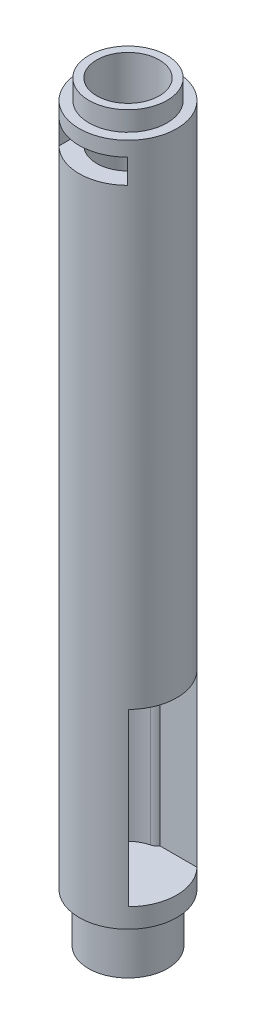
ISO-10303-21;
HEADER;
FILE_DESCRIPTION(('STEP AP214'),'2;1');
FILE_NAME('part.step','',(''),(''),'','','');
FILE_SCHEMA(('AUTOMOTIVE_DESIGN { 1 0 10303 214 1 1 1 1 }'));
ENDSEC;
DATA;
#1=APPLICATION_CONTEXT('core data for automotive mechanical design processes');
#2=APPLICATION_PROTOCOL_DEFINITION('international standard','automotive_design',2000,#1);
#3=PRODUCT_CONTEXT('',#1,'mechanical');
#4=PRODUCT('Part','Part','',(#3));
#5=PRODUCT_RELATED_PRODUCT_CATEGORY('part','',(#4));
#6=PRODUCT_DEFINITION_FORMATION('','',#4);
#7=PRODUCT_DEFINITION_CONTEXT('part definition',#1,'design');
#8=PRODUCT_DEFINITION('design','',#6,#7);
#9=PRODUCT_DEFINITION_SHAPE('','',#8);
#10=(LENGTH_UNIT() NAMED_UNIT(*) SI_UNIT(.MILLI.,.METRE.));
#11=(NAMED_UNIT(*) PLANE_ANGLE_UNIT() SI_UNIT($,.RADIAN.));
#12=(NAMED_UNIT(*) SI_UNIT($,.STERADIAN.) SOLID_ANGLE_UNIT());
#13=UNCERTAINTY_MEASURE_WITH_UNIT(LENGTH_MEASURE(1.E-05),#10,'distance_accuracy_value','');
#14=(GEOMETRIC_REPRESENTATION_CONTEXT(3) GLOBAL_UNCERTAINTY_ASSIGNED_CONTEXT((#13)) GLOBAL_UNIT_ASSIGNED_CONTEXT((#10,
#11,#12)) REPRESENTATION_CONTEXT('',''));
#15=CARTESIAN_POINT('',(0.,0.,0.));
#16=DIRECTION('',(0.,0.,1.));
#17=DIRECTION('',(1.,0.,0.));
#18=AXIS2_PLACEMENT_3D('',#15,#16,#17);
#19=CARTESIAN_POINT('',(0.,-12.7,0.));
#20=DIRECTION('',(0.,1.,0.));
#21=DIRECTION('',(0.,0.,1.));
#22=AXIS2_PLACEMENT_3D('',#19,#20,#21);
#23=CYLINDRICAL_SURFACE('',#22,10.287);
#24=CARTESIAN_POINT('',(0.,-12.7,0.));
#25=DIRECTION('',(0.,-1.,0.));
#26=DIRECTION('',(0.,0.,-1.));
#27=AXIS2_PLACEMENT_3D('',#24,#25,#26);
#28=CIRCLE('',#27,10.287);
#29=CARTESIAN_POINT('',(0.,-12.7,-10.287));
#30=VERTEX_POINT('',#29);
#31=EDGE_CURVE('E229',#30,#30,#28,.T.);
#32=ORIENTED_EDGE('',*,*,#31,.F.);
#33=EDGE_LOOP('',(#32));
#34=FACE_BOUND('',#33,.T.);
#35=CARTESIAN_POINT('',(0.,0.,0.));
#36=DIRECTION('',(0.,1.,0.));
#37=DIRECTION('',(0.,0.,1.));
#38=AXIS2_PLACEMENT_3D('',#35,#36,#37);
#39=CIRCLE('',#38,10.287);
#40=CARTESIAN_POINT('',(0.,0.,10.287));
#41=VERTEX_POINT('',#40);
#42=EDGE_CURVE('E235',#41,#41,#39,.F.);
#43=ORIENTED_EDGE('',*,*,#42,.T.);
#44=EDGE_LOOP('',(#43));
#45=FACE_BOUND('',#44,.T.);
#46=ADVANCED_FACE('F41',(#34,#45),#23,.T.);
#47=CARTESIAN_POINT('',(0.,-12.7,0.));
#48=DIRECTION('',(0.,-1.,0.));
#49=DIRECTION('',(0.,0.,-1.));
#50=AXIS2_PLACEMENT_3D('',#47,#48,#49);
#51=PLANE('',#50);
#52=ORIENTED_EDGE('',*,*,#31,.T.);
#53=EDGE_LOOP('',(#52));
#54=FACE_BOUND('',#53,.T.);
#55=ADVANCED_FACE('F305',(#54),#51,.T.);
#56=CARTESIAN_POINT('',(0.,0.,0.));
#57=DIRECTION('',(0.,1.,0.));
#58=DIRECTION('',(0.,0.,1.));
#59=AXIS2_PLACEMENT_3D('',#56,#57,#58);
#60=PLANE('',#59);
#61=CARTESIAN_POINT('',(0.,0.,0.));
#62=DIRECTION('',(0.,1.,0.));
#63=DIRECTION('',(0.,0.,1.));
#64=AXIS2_PLACEMENT_3D('',#61,#62,#63);
#65=CIRCLE('',#64,12.7);
#66=CARTESIAN_POINT('',(0.,0.,12.7));
#67=VERTEX_POINT('',#66);
#68=EDGE_CURVE('E232',#67,#67,#65,.T.);
#69=ORIENTED_EDGE('',*,*,#68,.F.);
#70=EDGE_LOOP('',(#69));
#71=FACE_BOUND('',#70,.T.);
#72=ORIENTED_EDGE('',*,*,#42,.F.);
#73=EDGE_LOOP('',(#72));
#74=FACE_BOUND('',#73,.T.);
#75=ADVANCED_FACE('F300',(#71,#74),#60,.F.);
#76=CARTESIAN_POINT('',(0.,177.8,0.));
#77=DIRECTION('',(0.,-1.,0.));
#78=DIRECTION('',(0.,0.,-1.));
#79=AXIS2_PLACEMENT_3D('',#76,#77,#78);
#80=CYLINDRICAL_SURFACE('',#79,12.7);
#81=CARTESIAN_POINT('',(0.,173.99,0.));
#82=DIRECTION('',(0.,1.,0.));
#83=DIRECTION('',(0.,0.,1.));
#84=AXIS2_PLACEMENT_3D('',#81,#82,#83);
#85=CIRCLE('',#84,12.7);
#86=CARTESIAN_POINT('',(-8.89000000000003,173.99,9.06961410424939));
#87=VERTEX_POINT('',#86);
#88=CARTESIAN_POINT('',(8.88999999999997,173.99,9.06961410424945));
#89=VERTEX_POINT('',#88);
#90=EDGE_CURVE('E157',#87,#89,#85,.T.);
#91=ORIENTED_EDGE('',*,*,#90,.T.);
#92=DIRECTION('',(0.,-1.,0.));
#93=VECTOR('',#92,1.);
#94=CARTESIAN_POINT('',(8.88999999999997,177.8,9.06961410424945));
#95=LINE('',#94,#93);
#96=CARTESIAN_POINT('',(8.88999999999997,167.64,9.06961410424945));
#97=VERTEX_POINT('',#96);
#98=EDGE_CURVE('E145',#89,#97,#95,.T.);
#99=ORIENTED_EDGE('',*,*,#98,.T.);
#100=CARTESIAN_POINT('',(0.,167.64,0.));
#101=DIRECTION('',(0.,-1.,0.));
#102=DIRECTION('',(0.,0.,-1.));
#103=AXIS2_PLACEMENT_3D('',#100,#101,#102);
#104=CIRCLE('',#103,12.7);
#105=CARTESIAN_POINT('',(-8.89000000000003,167.64,9.06961410424939));
#106=VERTEX_POINT('',#105);
#107=EDGE_CURVE('E164',#97,#106,#104,.T.);
#108=ORIENTED_EDGE('',*,*,#107,.T.);
#109=DIRECTION('',(0.,-1.,0.));
#110=VECTOR('',#109,1.);
#111=CARTESIAN_POINT('',(-8.89000000000003,177.8,9.06961410424939));
#112=LINE('',#111,#110);
#113=EDGE_CURVE('E240',#106,#87,#112,.F.);
#114=ORIENTED_EDGE('',*,*,#113,.T.);
#115=EDGE_LOOP('',(#91,#99,#108,#114));
#116=FACE_BOUND('',#115,.T.);
#117=ORIENTED_EDGE('',*,*,#68,.T.);
#118=EDGE_LOOP('',(#117));
#119=FACE_BOUND('',#118,.T.);
#120=CARTESIAN_POINT('',(0.,49.53,0.));
#121=DIRECTION('',(0.,1.,0.));
#122=DIRECTION('',(0.,0.,1.));
#123=AXIS2_PLACEMENT_3D('',#120,#121,#122);
#124=CIRCLE('',#123,12.7);
#125=CARTESIAN_POINT('',(9.06961410424942,49.53,8.89));
#126=VERTEX_POINT('',#125);
#127=CARTESIAN_POINT('',(9.06961410424942,49.53,-8.89));
#128=VERTEX_POINT('',#127);
#129=EDGE_CURVE('E177',#126,#128,#124,.T.);
#130=ORIENTED_EDGE('',*,*,#129,.T.);
#131=DIRECTION('',(0.,-1.,0.));
#132=VECTOR('',#131,1.);
#133=CARTESIAN_POINT('',(9.06961410424941,177.8,-8.89000000000001));
#134=LINE('',#133,#132);
#135=CARTESIAN_POINT('',(9.06961410424942,5.08,-8.89));
#136=VERTEX_POINT('',#135);
#137=EDGE_CURVE('E207',#128,#136,#134,.T.);
#138=ORIENTED_EDGE('',*,*,#137,.T.);
#139=CARTESIAN_POINT('',(0.,5.08,0.));
#140=DIRECTION('',(0.,-1.,0.));
#141=DIRECTION('',(0.,0.,-1.));
#142=AXIS2_PLACEMENT_3D('',#139,#140,#141);
#143=CIRCLE('',#142,12.7);
#144=CARTESIAN_POINT('',(9.06961410424943,5.08,8.89));
#145=VERTEX_POINT('',#144);
#146=EDGE_CURVE('E187',#136,#145,#143,.T.);
#147=ORIENTED_EDGE('',*,*,#146,.T.);
#148=DIRECTION('',(0.,-1.,0.));
#149=VECTOR('',#148,1.);
#150=CARTESIAN_POINT('',(9.06961410424943,177.8,8.88999999999999));
#151=LINE('',#150,#149);
#152=EDGE_CURVE('E204',#145,#126,#151,.F.);
#153=ORIENTED_EDGE('',*,*,#152,.T.);
#154=EDGE_LOOP('',(#130,#138,#147,#153));
#155=FACE_BOUND('',#154,.T.);
#156=CARTESIAN_POINT('',(0.,177.8,0.));
#157=DIRECTION('',(0.,1.,0.));
#158=DIRECTION('',(0.,0.,1.));
#159=AXIS2_PLACEMENT_3D('',#156,#157,#158);
#160=CIRCLE('',#159,12.7);
#161=CARTESIAN_POINT('',(0.,177.8,12.7));
#162=VERTEX_POINT('',#161);
#163=EDGE_CURVE('E191',#162,#162,#160,.T.);
#164=ORIENTED_EDGE('',*,*,#163,.F.);
#165=EDGE_LOOP('',(#164));
#166=FACE_BOUND('',#165,.T.);
#167=ADVANCED_FACE('F258',(#116,#119,#155,#166),#80,.T.);
#168=CARTESIAN_POINT('',(0.,0.,0.));
#169=DIRECTION('',(0.,1.,0.));
#170=DIRECTION('',(0.,0.,1.));
#171=AXIS2_PLACEMENT_3D('',#168,#169,#170);
#172=CYLINDRICAL_SURFACE('',#171,8.128);
#173=DIRECTION('',(0.,1.,0.));
#174=VECTOR('',#173,1.);
#175=CARTESIAN_POINT('',(7.93852609266397,0.,1.74476000529968));
#176=LINE('',#175,#174);
#177=CARTESIAN_POINT('',(7.93852609266397,167.64,1.74476000529968));
#178=VERTEX_POINT('',#177);
#179=CARTESIAN_POINT('',(7.93852609266397,173.99,1.74476000529968));
#180=VERTEX_POINT('',#179);
#181=EDGE_CURVE('E136',#178,#180,#176,.T.);
#182=ORIENTED_EDGE('',*,*,#181,.T.);
#183=CARTESIAN_POINT('',(0.,173.99,0.));
#184=DIRECTION('',(0.,1.,0.));
#185=DIRECTION('',(0.,0.,1.));
#186=AXIS2_PLACEMENT_3D('',#183,#184,#185);
#187=CIRCLE('',#186,8.128);
#188=CARTESIAN_POINT('',(-7.93852609266397,173.99,1.74476000529966));
#189=VERTEX_POINT('',#188);
#190=EDGE_CURVE('E55',#180,#189,#187,.F.);
#191=ORIENTED_EDGE('',*,*,#190,.T.);
#192=DIRECTION('',(0.,1.,0.));
#193=VECTOR('',#192,1.);
#194=CARTESIAN_POINT('',(-7.93852609266397,0.,1.74476000529966));
#195=LINE('',#194,#193);
#196=CARTESIAN_POINT('',(-7.93852609266397,167.64,1.74476000529966));
#197=VERTEX_POINT('',#196);
#198=EDGE_CURVE('E244',#189,#197,#195,.F.);
#199=ORIENTED_EDGE('',*,*,#198,.T.);
#200=CARTESIAN_POINT('',(0.,167.64,0.));
#201=DIRECTION('',(0.,-1.,0.));
#202=DIRECTION('',(0.,0.,-1.));
#203=AXIS2_PLACEMENT_3D('',#200,#201,#202);
#204=CIRCLE('',#203,8.128);
#205=EDGE_CURVE('E63',#197,#178,#204,.F.);
#206=ORIENTED_EDGE('',*,*,#205,.T.);
#207=EDGE_LOOP('',(#182,#191,#199,#206));
#208=FACE_BOUND('',#207,.T.);
#209=CARTESIAN_POINT('',(0.,182.88,0.));
#210=DIRECTION('',(0.,1.,0.));
#211=DIRECTION('',(0.,0.,1.));
#212=AXIS2_PLACEMENT_3D('',#209,#210,#211);
#213=CIRCLE('',#212,8.128);
#214=CARTESIAN_POINT('',(0.,182.88,8.128));
#215=VERTEX_POINT('',#214);
#216=EDGE_CURVE('E199',#215,#215,#213,.T.);
#217=ORIENTED_EDGE('',*,*,#216,.T.);
#218=EDGE_LOOP('',(#217));
#219=FACE_BOUND('',#218,.T.);
#220=DIRECTION('',(0.,1.,0.));
#221=VECTOR('',#220,1.);
#222=CARTESIAN_POINT('',(-1.97082681803817,0.,7.88544390971755));
#223=LINE('',#222,#221);
#224=CARTESIAN_POINT('',(-1.97082681803817,49.53,7.88544390971755));
#225=VERTEX_POINT('',#224);
#226=CARTESIAN_POINT('',(-1.97082681803817,5.08,7.88544390971755));
#227=VERTEX_POINT('',#226);
#228=EDGE_CURVE('E210',#225,#227,#223,.F.);
#229=ORIENTED_EDGE('',*,*,#228,.T.);
#230=CARTESIAN_POINT('',(0.,5.08,0.));
#231=DIRECTION('',(0.,-1.,0.));
#232=DIRECTION('',(0.,0.,-1.));
#233=AXIS2_PLACEMENT_3D('',#230,#231,#232);
#234=CIRCLE('',#233,8.128);
#235=CARTESIAN_POINT('',(-1.97082681803816,5.08,-7.88544390971755));
#236=VERTEX_POINT('',#235);
#237=EDGE_CURVE('E226',#236,#227,#234,.F.);
#238=ORIENTED_EDGE('',*,*,#237,.F.);
#239=DIRECTION('',(0.,1.,0.));
#240=VECTOR('',#239,1.);
#241=CARTESIAN_POINT('',(-1.97082681803816,0.,-7.88544390971755));
#242=LINE('',#241,#240);
#243=CARTESIAN_POINT('',(-1.97082681803816,49.53,-7.88544390971755));
#244=VERTEX_POINT('',#243);
#245=EDGE_CURVE('E213',#236,#244,#242,.T.);
#246=ORIENTED_EDGE('',*,*,#245,.T.);
#247=CARTESIAN_POINT('',(0.,49.53,0.));
#248=DIRECTION('',(0.,1.,0.));
#249=DIRECTION('',(0.,0.,1.));
#250=AXIS2_PLACEMENT_3D('',#247,#248,#249);
#251=CIRCLE('',#250,8.128);
#252=EDGE_CURVE('E202',#244,#225,#251,.F.);
#253=ORIENTED_EDGE('',*,*,#252,.T.);
#254=EDGE_LOOP('',(#229,#238,#246,#253));
#255=FACE_BOUND('',#254,.T.);
#256=ADVANCED_FACE('F260',(#208,#219,#255),#172,.F.);
#257=CARTESIAN_POINT('',(0.,177.8,0.));
#258=DIRECTION('',(0.,1.,0.));
#259=DIRECTION('',(0.,0.,1.));
#260=AXIS2_PLACEMENT_3D('',#257,#258,#259);
#261=PLANE('',#260);
#262=CARTESIAN_POINT('',(0.,177.8,0.));
#263=DIRECTION('',(0.,1.,0.));
#264=DIRECTION('',(0.,0.,1.));
#265=AXIS2_PLACEMENT_3D('',#262,#263,#264);
#266=CIRCLE('',#265,10.16);
#267=CARTESIAN_POINT('',(0.,177.8,10.16));
#268=VERTEX_POINT('',#267);
#269=EDGE_CURVE('E190',#268,#268,#266,.T.);
#270=ORIENTED_EDGE('',*,*,#269,.F.);
#271=EDGE_LOOP('',(#270));
#272=FACE_BOUND('',#271,.T.);
#273=ORIENTED_EDGE('',*,*,#163,.T.);
#274=EDGE_LOOP('',(#273));
#275=FACE_BOUND('',#274,.T.);
#276=ADVANCED_FACE('F263',(#272,#275),#261,.T.);
#277=CARTESIAN_POINT('',(0.,182.88,0.));
#278=DIRECTION('',(0.,-1.,0.));
#279=DIRECTION('',(0.,0.,-1.));
#280=AXIS2_PLACEMENT_3D('',#277,#278,#279);
#281=CYLINDRICAL_SURFACE('',#280,10.16);
#282=CARTESIAN_POINT('',(0.,182.88,0.));
#283=DIRECTION('',(0.,1.,0.));
#284=DIRECTION('',(0.,0.,1.));
#285=AXIS2_PLACEMENT_3D('',#282,#283,#284);
#286=CIRCLE('',#285,10.16);
#287=CARTESIAN_POINT('',(0.,182.88,10.16));
#288=VERTEX_POINT('',#287);
#289=EDGE_CURVE('E194',#288,#288,#286,.T.);
#290=ORIENTED_EDGE('',*,*,#289,.F.);
#291=EDGE_LOOP('',(#290));
#292=FACE_BOUND('',#291,.T.);
#293=ORIENTED_EDGE('',*,*,#269,.T.);
#294=EDGE_LOOP('',(#293));
#295=FACE_BOUND('',#294,.T.);
#296=ADVANCED_FACE('F332',(#292,#295),#281,.T.);
#297=CARTESIAN_POINT('',(0.,182.88,0.));
#298=DIRECTION('',(0.,1.,0.));
#299=DIRECTION('',(0.,0.,1.));
#300=AXIS2_PLACEMENT_3D('',#297,#298,#299);
#301=PLANE('',#300);
#302=ORIENTED_EDGE('',*,*,#216,.F.);
#303=EDGE_LOOP('',(#302));
#304=FACE_BOUND('',#303,.T.);
#305=ORIENTED_EDGE('',*,*,#289,.T.);
#306=EDGE_LOOP('',(#305));
#307=FACE_BOUND('',#306,.T.);
#308=ADVANCED_FACE('F329',(#304,#307),#301,.T.);
#309=CARTESIAN_POINT('',(-0.508000000000002,5.08,-8.89));
#310=DIRECTION('',(0.,0.,-1.));
#311=DIRECTION('',(0.,1.,0.));
#312=AXIS2_PLACEMENT_3D('',#309,#310,#311);
#313=PLANE('',#312);
#314=DIRECTION('',(1.,0.,0.));
#315=VECTOR('',#314,1.);
#316=CARTESIAN_POINT('',(-0.508000000000002,49.53,-8.89));
#317=LINE('',#316,#315);
#318=CARTESIAN_POINT('',(-0.508000000000002,49.53,-8.89));
#319=VERTEX_POINT('',#318);
#320=EDGE_CURVE('E173',#319,#128,#317,.T.);
#321=ORIENTED_EDGE('',*,*,#320,.F.);
#322=DIRECTION('',(0.,1.,0.));
#323=VECTOR('',#322,1.);
#324=CARTESIAN_POINT('',(-0.508000000000002,5.08,-8.89));
#325=LINE('',#324,#323);
#326=CARTESIAN_POINT('',(-0.508000000000002,5.08,-8.89));
#327=VERTEX_POINT('',#326);
#328=EDGE_CURVE('E167',#327,#319,#325,.T.);
#329=ORIENTED_EDGE('',*,*,#328,.F.);
#330=DIRECTION('',(1.,0.,0.));
#331=VECTOR('',#330,1.);
#332=CARTESIAN_POINT('',(-0.508000000000002,5.08,-8.89));
#333=LINE('',#332,#331);
#334=EDGE_CURVE('E174',#327,#136,#333,.T.);
#335=ORIENTED_EDGE('',*,*,#334,.T.);
#336=ORIENTED_EDGE('',*,*,#137,.F.);
#337=EDGE_LOOP('',(#321,#329,#335,#336));
#338=FACE_BOUND('',#337,.T.);
#339=ADVANCED_FACE('F284',(#338),#313,.F.);
#340=CARTESIAN_POINT('',(-0.508000000000002,5.08,8.89));
#341=DIRECTION('',(0.,0.,1.));
#342=DIRECTION('',(0.,-1.,0.));
#343=AXIS2_PLACEMENT_3D('',#340,#341,#342);
#344=PLANE('',#343);
#345=DIRECTION('',(1.,0.,0.));
#346=VECTOR('',#345,1.);
#347=CARTESIAN_POINT('',(-0.508000000000002,5.08,8.89));
#348=LINE('',#347,#346);
#349=CARTESIAN_POINT('',(-0.508000000000002,5.08,8.89));
#350=VERTEX_POINT('',#349);
#351=EDGE_CURVE('E178',#350,#145,#348,.T.);
#352=ORIENTED_EDGE('',*,*,#351,.F.);
#353=DIRECTION('',(0.,-1.,0.));
#354=VECTOR('',#353,1.);
#355=CARTESIAN_POINT('',(-0.508000000000002,5.08,8.89));
#356=LINE('',#355,#354);
#357=CARTESIAN_POINT('',(-0.508000000000002,49.53,8.89));
#358=VERTEX_POINT('',#357);
#359=EDGE_CURVE('E170',#358,#350,#356,.T.);
#360=ORIENTED_EDGE('',*,*,#359,.F.);
#361=DIRECTION('',(1.,0.,0.));
#362=VECTOR('',#361,1.);
#363=CARTESIAN_POINT('',(-0.508000000000002,49.53,8.89));
#364=LINE('',#363,#362);
#365=EDGE_CURVE('E181',#358,#126,#364,.T.);
#366=ORIENTED_EDGE('',*,*,#365,.T.);
#367=ORIENTED_EDGE('',*,*,#152,.F.);
#368=EDGE_LOOP('',(#352,#360,#366,#367));
#369=FACE_BOUND('',#368,.T.);
#370=ADVANCED_FACE('F289',(#369),#344,.F.);
#371=CARTESIAN_POINT('',(-0.508000000000002,49.53,8.89));
#372=DIRECTION('',(0.,1.,0.));
#373=DIRECTION('',(0.,0.,1.));
#374=AXIS2_PLACEMENT_3D('',#371,#372,#373);
#375=PLANE('',#374);
#376=ORIENTED_EDGE('',*,*,#365,.F.);
#377=CARTESIAN_POINT('',(-2.5867101986751,49.53,10.3496451315043));
#378=DIRECTION('',(0.,1.,0.));
#379=DIRECTION('',(0.,0.,1.));
#380=AXIS2_PLACEMENT_3D('',#377,#378,#379);
#381=CIRCLE('',#380,2.54);
#382=EDGE_CURVE('E223',#358,#225,#381,.T.);
#383=ORIENTED_EDGE('',*,*,#382,.T.);
#384=ORIENTED_EDGE('',*,*,#252,.F.);
#385=CARTESIAN_POINT('',(-2.58671019867509,49.53,-10.3496451315043));
#386=DIRECTION('',(0.,1.,0.));
#387=DIRECTION('',(0.,0.,1.));
#388=AXIS2_PLACEMENT_3D('',#385,#386,#387);
#389=CIRCLE('',#388,2.54);
#390=EDGE_CURVE('E216',#244,#319,#389,.T.);
#391=ORIENTED_EDGE('',*,*,#390,.T.);
#392=ORIENTED_EDGE('',*,*,#320,.T.);
#393=ORIENTED_EDGE('',*,*,#129,.F.);
#394=EDGE_LOOP('',(#376,#383,#384,#391,#392,#393));
#395=FACE_BOUND('',#394,.T.);
#396=ADVANCED_FACE('F281',(#395),#375,.F.);
#397=CARTESIAN_POINT('',(-2.58671019867509,0.,-10.3496451315043));
#398=DIRECTION('',(0.,1.,0.));
#399=DIRECTION('',(0.,0.,1.));
#400=AXIS2_PLACEMENT_3D('',#397,#398,#399);
#401=CYLINDRICAL_SURFACE('',#400,2.54);
#402=CARTESIAN_POINT('',(-2.58671019867509,5.08,-10.3496451315043));
#403=DIRECTION('',(0.,-1.,0.));
#404=DIRECTION('',(0.,0.,-1.));
#405=AXIS2_PLACEMENT_3D('',#402,#403,#404);
#406=CIRCLE('',#405,2.54);
#407=EDGE_CURVE('E218',#327,#236,#406,.T.);
#408=ORIENTED_EDGE('',*,*,#407,.F.);
#409=ORIENTED_EDGE('',*,*,#328,.T.);
#410=ORIENTED_EDGE('',*,*,#390,.F.);
#411=ORIENTED_EDGE('',*,*,#245,.F.);
#412=EDGE_LOOP('',(#408,#409,#410,#411));
#413=FACE_BOUND('',#412,.T.);
#414=ADVANCED_FACE('F277',(#413),#401,.T.);
#415=CARTESIAN_POINT('',(-2.5867101986751,0.,10.3496451315043));
#416=DIRECTION('',(0.,-1.,0.));
#417=DIRECTION('',(0.,0.,-1.));
#418=AXIS2_PLACEMENT_3D('',#415,#416,#417);
#419=CYLINDRICAL_SURFACE('',#418,2.54);
#420=ORIENTED_EDGE('',*,*,#382,.F.);
#421=ORIENTED_EDGE('',*,*,#359,.T.);
#422=CARTESIAN_POINT('',(-2.5867101986751,5.08,10.3496451315043));
#423=DIRECTION('',(0.,-1.,0.));
#424=DIRECTION('',(0.,0.,-1.));
#425=AXIS2_PLACEMENT_3D('',#422,#423,#424);
#426=CIRCLE('',#425,2.54);
#427=EDGE_CURVE('E221',#227,#350,#426,.T.);
#428=ORIENTED_EDGE('',*,*,#427,.F.);
#429=ORIENTED_EDGE('',*,*,#228,.F.);
#430=EDGE_LOOP('',(#420,#421,#428,#429));
#431=FACE_BOUND('',#430,.T.);
#432=ADVANCED_FACE('F290',(#431),#419,.T.);
#433=CARTESIAN_POINT('',(-0.508000000000002,5.08,8.89));
#434=DIRECTION('',(0.,-1.,0.));
#435=DIRECTION('',(0.,0.,-1.));
#436=AXIS2_PLACEMENT_3D('',#433,#434,#435);
#437=PLANE('',#436);
#438=ORIENTED_EDGE('',*,*,#237,.T.);
#439=ORIENTED_EDGE('',*,*,#427,.T.);
#440=ORIENTED_EDGE('',*,*,#351,.T.);
#441=ORIENTED_EDGE('',*,*,#146,.F.);
#442=ORIENTED_EDGE('',*,*,#334,.F.);
#443=ORIENTED_EDGE('',*,*,#407,.T.);
#444=EDGE_LOOP('',(#438,#439,#440,#441,#442,#443));
#445=FACE_BOUND('',#444,.T.);
#446=ADVANCED_FACE('F272',(#445),#437,.F.);
#447=CARTESIAN_POINT('',(8.88999999999997,167.64,4.318));
#448=DIRECTION('',(1.,0.,0.));
#449=DIRECTION('',(0.,0.,-1.));
#450=AXIS2_PLACEMENT_3D('',#447,#448,#449);
#451=PLANE('',#450);
#452=DIRECTION('',(0.,0.,1.));
#453=VECTOR('',#452,1.);
#454=CARTESIAN_POINT('',(8.88999999999997,173.99,4.318));
#455=LINE('',#454,#453);
#456=CARTESIAN_POINT('',(8.88999999999997,173.99,4.318));
#457=VERTEX_POINT('',#456);
#458=EDGE_CURVE('E130',#457,#89,#455,.T.);
#459=ORIENTED_EDGE('',*,*,#458,.F.);
#460=DIRECTION('',(0.,1.,0.));
#461=VECTOR('',#460,1.);
#462=CARTESIAN_POINT('',(8.88999999999997,167.64,4.318));
#463=LINE('',#462,#461);
#464=CARTESIAN_POINT('',(8.88999999999997,167.64,4.318));
#465=VERTEX_POINT('',#464);
#466=EDGE_CURVE('E142',#465,#457,#463,.T.);
#467=ORIENTED_EDGE('',*,*,#466,.F.);
#468=DIRECTION('',(0.,0.,1.));
#469=VECTOR('',#468,1.);
#470=CARTESIAN_POINT('',(8.88999999999997,167.64,4.318));
#471=LINE('',#470,#469);
#472=EDGE_CURVE('E155',#465,#97,#471,.T.);
#473=ORIENTED_EDGE('',*,*,#472,.T.);
#474=ORIENTED_EDGE('',*,*,#98,.F.);
#475=EDGE_LOOP('',(#459,#467,#473,#474));
#476=FACE_BOUND('',#475,.T.);
#477=ADVANCED_FACE('F140',(#476),#451,.F.);
#478=CARTESIAN_POINT('',(-8.89000000000003,167.64,4.318));
#479=DIRECTION('',(-1.,0.,0.));
#480=DIRECTION('',(0.,0.,1.));
#481=AXIS2_PLACEMENT_3D('',#478,#479,#480);
#482=PLANE('',#481);
#483=DIRECTION('',(0.,0.,1.));
#484=VECTOR('',#483,1.);
#485=CARTESIAN_POINT('',(-8.89000000000003,167.64,4.318));
#486=LINE('',#485,#484);
#487=CARTESIAN_POINT('',(-8.89000000000003,167.64,4.318));
#488=VERTEX_POINT('',#487);
#489=EDGE_CURVE('E158',#488,#106,#486,.T.);
#490=ORIENTED_EDGE('',*,*,#489,.F.);
#491=DIRECTION('',(0.,-1.,0.));
#492=VECTOR('',#491,1.);
#493=CARTESIAN_POINT('',(-8.89000000000003,167.64,4.318));
#494=LINE('',#493,#492);
#495=CARTESIAN_POINT('',(-8.89000000000003,173.99,4.318));
#496=VERTEX_POINT('',#495);
#497=EDGE_CURVE('E148',#496,#488,#494,.T.);
#498=ORIENTED_EDGE('',*,*,#497,.F.);
#499=DIRECTION('',(0.,0.,1.));
#500=VECTOR('',#499,1.);
#501=CARTESIAN_POINT('',(-8.89000000000003,173.99,4.318));
#502=LINE('',#501,#500);
#503=EDGE_CURVE('E147',#496,#87,#502,.T.);
#504=ORIENTED_EDGE('',*,*,#503,.T.);
#505=ORIENTED_EDGE('',*,*,#113,.F.);
#506=EDGE_LOOP('',(#490,#498,#504,#505));
#507=FACE_BOUND('',#506,.T.);
#508=ADVANCED_FACE('F255',(#507),#482,.F.);
#509=CARTESIAN_POINT('',(-8.89000000000003,167.64,4.318));
#510=DIRECTION('',(0.,-1.,0.));
#511=DIRECTION('',(0.,0.,-1.));
#512=AXIS2_PLACEMENT_3D('',#509,#510,#511);
#513=PLANE('',#512);
#514=ORIENTED_EDGE('',*,*,#472,.F.);
#515=CARTESIAN_POINT('',(10.4193154966215,167.64,2.28999750695583));
#516=DIRECTION('',(0.,-1.,0.));
#517=DIRECTION('',(0.,0.,-1.));
#518=AXIS2_PLACEMENT_3D('',#515,#516,#517);
#519=CIRCLE('',#518,2.54);
#520=EDGE_CURVE('E135',#465,#178,#519,.T.);
#521=ORIENTED_EDGE('',*,*,#520,.T.);
#522=ORIENTED_EDGE('',*,*,#205,.F.);
#523=CARTESIAN_POINT('',(-10.4193154966215,167.64,2.2899975069558));
#524=DIRECTION('',(0.,-1.,0.));
#525=DIRECTION('',(0.,0.,-1.));
#526=AXIS2_PLACEMENT_3D('',#523,#524,#525);
#527=CIRCLE('',#526,2.54);
#528=EDGE_CURVE('E49',#197,#488,#527,.T.);
#529=ORIENTED_EDGE('',*,*,#528,.T.);
#530=ORIENTED_EDGE('',*,*,#489,.T.);
#531=ORIENTED_EDGE('',*,*,#107,.F.);
#532=EDGE_LOOP('',(#514,#521,#522,#529,#530,#531));
#533=FACE_BOUND('',#532,.T.);
#534=ADVANCED_FACE('F250',(#533),#513,.F.);
#535=CARTESIAN_POINT('',(-8.89000000000003,173.99,4.318));
#536=DIRECTION('',(0.,1.,0.));
#537=DIRECTION('',(0.,0.,1.));
#538=AXIS2_PLACEMENT_3D('',#535,#536,#537);
#539=PLANE('',#538);
#540=ORIENTED_EDGE('',*,*,#503,.F.);
#541=CARTESIAN_POINT('',(-10.4193154966215,173.99,2.2899975069558));
#542=DIRECTION('',(0.,1.,0.));
#543=DIRECTION('',(0.,0.,1.));
#544=AXIS2_PLACEMENT_3D('',#541,#542,#543);
#545=CIRCLE('',#544,2.54);
#546=EDGE_CURVE('E11',#496,#189,#545,.T.);
#547=ORIENTED_EDGE('',*,*,#546,.T.);
#548=ORIENTED_EDGE('',*,*,#190,.F.);
#549=CARTESIAN_POINT('',(10.4193154966215,173.99,2.28999750695583));
#550=DIRECTION('',(0.,1.,0.));
#551=DIRECTION('',(0.,0.,1.));
#552=AXIS2_PLACEMENT_3D('',#549,#550,#551);
#553=CIRCLE('',#552,2.54);
#554=EDGE_CURVE('E127',#180,#457,#553,.T.);
#555=ORIENTED_EDGE('',*,*,#554,.T.);
#556=ORIENTED_EDGE('',*,*,#458,.T.);
#557=ORIENTED_EDGE('',*,*,#90,.F.);
#558=EDGE_LOOP('',(#540,#547,#548,#555,#556,#557));
#559=FACE_BOUND('',#558,.T.);
#560=ADVANCED_FACE('F129',(#559),#539,.F.);
#561=CARTESIAN_POINT('',(10.4193154966215,0.,2.28999750695583));
#562=DIRECTION('',(0.,1.,0.));
#563=DIRECTION('',(0.,0.,1.));
#564=AXIS2_PLACEMENT_3D('',#561,#562,#563);
#565=CYLINDRICAL_SURFACE('',#564,2.54);
#566=ORIENTED_EDGE('',*,*,#520,.F.);
#567=ORIENTED_EDGE('',*,*,#466,.T.);
#568=ORIENTED_EDGE('',*,*,#554,.F.);
#569=ORIENTED_EDGE('',*,*,#181,.F.);
#570=EDGE_LOOP('',(#566,#567,#568,#569));
#571=FACE_BOUND('',#570,.T.);
#572=ADVANCED_FACE('F150',(#571),#565,.T.);
#573=CARTESIAN_POINT('',(-10.4193154966215,0.,2.2899975069558));
#574=DIRECTION('',(0.,-1.,0.));
#575=DIRECTION('',(0.,0.,-1.));
#576=AXIS2_PLACEMENT_3D('',#573,#574,#575);
#577=CYLINDRICAL_SURFACE('',#576,2.54);
#578=ORIENTED_EDGE('',*,*,#546,.F.);
#579=ORIENTED_EDGE('',*,*,#497,.T.);
#580=ORIENTED_EDGE('',*,*,#528,.F.);
#581=ORIENTED_EDGE('',*,*,#198,.F.);
#582=EDGE_LOOP('',(#578,#579,#580,#581));
#583=FACE_BOUND('',#582,.T.);
#584=ADVANCED_FACE('F43',(#583),#577,.T.);
#585=CLOSED_SHELL('',(#46,#55,#75,#167,#256,#276,#296,#308,#339,#370,#396,#414,#432,#446,#477,
#508,#534,#560,#572,#584));
#586=MANIFOLD_SOLID_BREP('B2',#585);
#587=ADVANCED_BREP_SHAPE_REPRESENTATION('',(#18,#586),#14);
#588=SHAPE_DEFINITION_REPRESENTATION(#9,#587);
ENDSEC;
END-ISO-10303-21;
